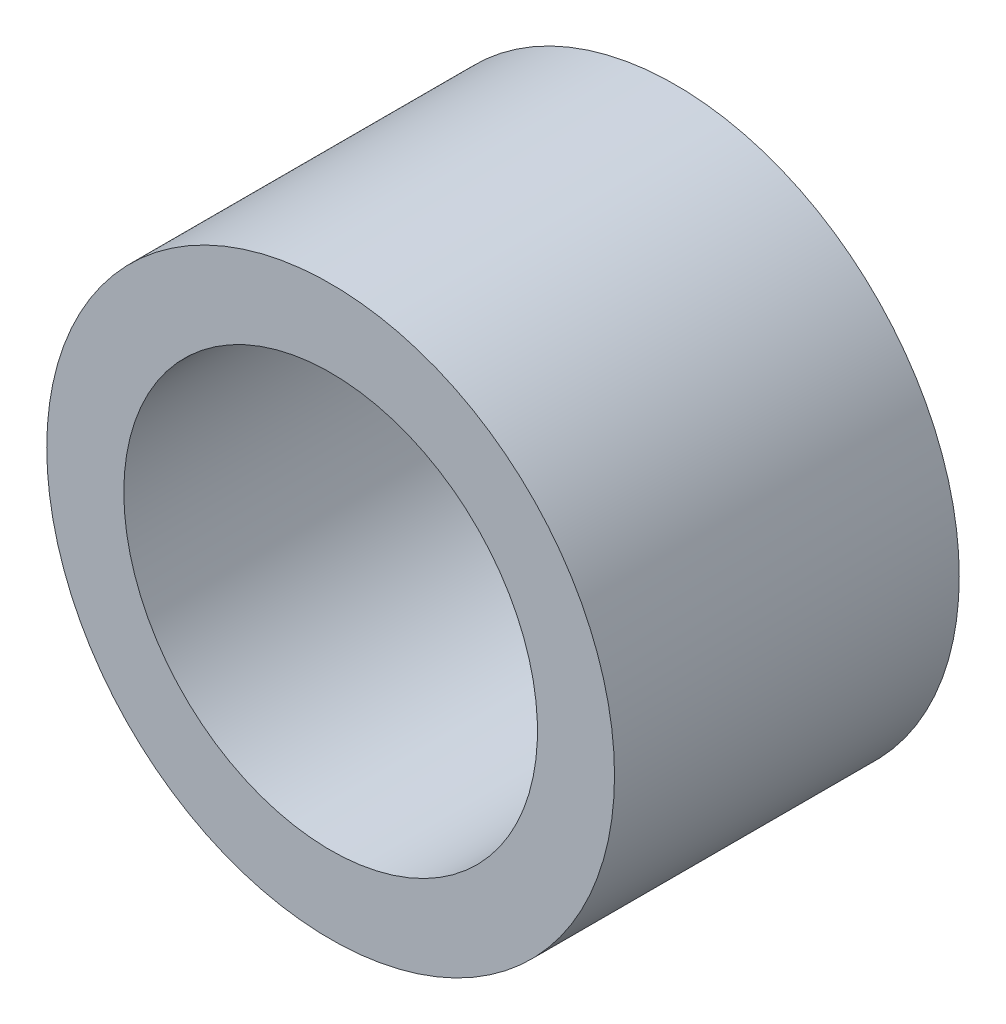
ISO-10303-21;
HEADER;
FILE_DESCRIPTION(('STEP AP214'),'2;1');
FILE_NAME('part.step','',(''),(''),'','','');
FILE_SCHEMA(('AUTOMOTIVE_DESIGN { 1 0 10303 214 1 1 1 1 }'));
ENDSEC;
DATA;
#1=APPLICATION_CONTEXT('core data for automotive mechanical design processes');
#2=APPLICATION_PROTOCOL_DEFINITION('international standard','automotive_design',2000,#1);
#3=PRODUCT_CONTEXT('',#1,'mechanical');
#4=PRODUCT('Part','Part','',(#3));
#5=PRODUCT_RELATED_PRODUCT_CATEGORY('part','',(#4));
#6=PRODUCT_DEFINITION_FORMATION('','',#4);
#7=PRODUCT_DEFINITION_CONTEXT('part definition',#1,'design');
#8=PRODUCT_DEFINITION('design','',#6,#7);
#9=PRODUCT_DEFINITION_SHAPE('','',#8);
#10=(LENGTH_UNIT() NAMED_UNIT(*) SI_UNIT(.MILLI.,.METRE.));
#11=(NAMED_UNIT(*) PLANE_ANGLE_UNIT() SI_UNIT($,.RADIAN.));
#12=(NAMED_UNIT(*) SI_UNIT($,.STERADIAN.) SOLID_ANGLE_UNIT());
#13=UNCERTAINTY_MEASURE_WITH_UNIT(LENGTH_MEASURE(1.E-05),#10,'distance_accuracy_value','');
#14=(GEOMETRIC_REPRESENTATION_CONTEXT(3) GLOBAL_UNCERTAINTY_ASSIGNED_CONTEXT((#13)) GLOBAL_UNIT_ASSIGNED_CONTEXT((#10,
#11,#12)) REPRESENTATION_CONTEXT('',''));
#15=CARTESIAN_POINT('',(0.,0.,0.));
#16=DIRECTION('',(0.,0.,1.));
#17=DIRECTION('',(1.,0.,0.));
#18=AXIS2_PLACEMENT_3D('',#15,#16,#17);
#19=CARTESIAN_POINT('',(0.,0.,8.5));
#20=DIRECTION('',(0.,0.,-1.));
#21=DIRECTION('',(-1.,0.,0.));
#22=AXIS2_PLACEMENT_3D('',#19,#20,#21);
#23=CYLINDRICAL_SURFACE('',#22,5.1);
#24=CARTESIAN_POINT('',(0.,0.,0.));
#25=DIRECTION('',(0.,0.,-1.));
#26=DIRECTION('',(-1.,0.,0.));
#27=AXIS2_PLACEMENT_3D('',#24,#25,#26);
#28=CIRCLE('',#27,5.1);
#29=CARTESIAN_POINT('',(-5.1,0.,0.));
#30=VERTEX_POINT('',#29);
#31=EDGE_CURVE('E26',#30,#30,#28,.T.);
#32=ORIENTED_EDGE('',*,*,#31,.T.);
#33=EDGE_LOOP('',(#32));
#34=FACE_BOUND('',#33,.T.);
#35=CARTESIAN_POINT('',(0.,0.,8.5));
#36=DIRECTION('',(0.,0.,-1.));
#37=DIRECTION('',(-1.,0.,0.));
#38=AXIS2_PLACEMENT_3D('',#35,#36,#37);
#39=CIRCLE('',#38,5.1);
#40=CARTESIAN_POINT('',(-5.1,0.,8.5));
#41=VERTEX_POINT('',#40);
#42=EDGE_CURVE('E17',#41,#41,#39,.T.);
#43=ORIENTED_EDGE('',*,*,#42,.F.);
#44=EDGE_LOOP('',(#43));
#45=FACE_BOUND('',#44,.T.);
#46=ADVANCED_FACE('F14',(#34,#45),#23,.F.);
#47=CARTESIAN_POINT('',(0.,0.,8.5));
#48=DIRECTION('',(0.,0.,1.));
#49=DIRECTION('',(1.,0.,0.));
#50=AXIS2_PLACEMENT_3D('',#47,#48,#49);
#51=PLANE('',#50);
#52=ORIENTED_EDGE('',*,*,#42,.T.);
#53=EDGE_LOOP('',(#52));
#54=FACE_BOUND('',#53,.T.);
#55=CARTESIAN_POINT('',(0.,0.,8.5));
#56=DIRECTION('',(0.,0.,-1.));
#57=DIRECTION('',(-1.,0.,0.));
#58=AXIS2_PLACEMENT_3D('',#55,#56,#57);
#59=CIRCLE('',#58,7.);
#60=CARTESIAN_POINT('',(-7.,0.,8.5));
#61=VERTEX_POINT('',#60);
#62=EDGE_CURVE('E21',#61,#61,#59,.T.);
#63=ORIENTED_EDGE('',*,*,#62,.F.);
#64=EDGE_LOOP('',(#63));
#65=FACE_BOUND('',#64,.T.);
#66=ADVANCED_FACE('F34',(#54,#65),#51,.T.);
#67=CARTESIAN_POINT('',(0.,0.,0.));
#68=DIRECTION('',(0.,0.,1.));
#69=DIRECTION('',(1.,0.,0.));
#70=AXIS2_PLACEMENT_3D('',#67,#68,#69);
#71=PLANE('',#70);
#72=ORIENTED_EDGE('',*,*,#31,.F.);
#73=EDGE_LOOP('',(#72));
#74=FACE_BOUND('',#73,.T.);
#75=CARTESIAN_POINT('',(0.,0.,0.));
#76=DIRECTION('',(0.,0.,-1.));
#77=DIRECTION('',(-1.,0.,0.));
#78=AXIS2_PLACEMENT_3D('',#75,#76,#77);
#79=CIRCLE('',#78,7.);
#80=CARTESIAN_POINT('',(-7.,0.,0.));
#81=VERTEX_POINT('',#80);
#82=EDGE_CURVE('E10',#81,#81,#79,.F.);
#83=ORIENTED_EDGE('',*,*,#82,.F.);
#84=EDGE_LOOP('',(#83));
#85=FACE_BOUND('',#84,.T.);
#86=ADVANCED_FACE('F42',(#74,#85),#71,.F.);
#87=CARTESIAN_POINT('',(0.,0.,8.5));
#88=DIRECTION('',(0.,0.,-1.));
#89=DIRECTION('',(-1.,0.,0.));
#90=AXIS2_PLACEMENT_3D('',#87,#88,#89);
#91=CYLINDRICAL_SURFACE('',#90,7.);
#92=ORIENTED_EDGE('',*,*,#82,.T.);
#93=EDGE_LOOP('',(#92));
#94=FACE_BOUND('',#93,.T.);
#95=ORIENTED_EDGE('',*,*,#62,.T.);
#96=EDGE_LOOP('',(#95));
#97=FACE_BOUND('',#96,.T.);
#98=ADVANCED_FACE('F43',(#94,#97),#91,.T.);
#99=CLOSED_SHELL('',(#46,#66,#86,#98));
#100=MANIFOLD_SOLID_BREP('B1',#99);
#101=ADVANCED_BREP_SHAPE_REPRESENTATION('',(#18,#100),#14);
#102=SHAPE_DEFINITION_REPRESENTATION(#9,#101);
ENDSEC;
END-ISO-10303-21;
